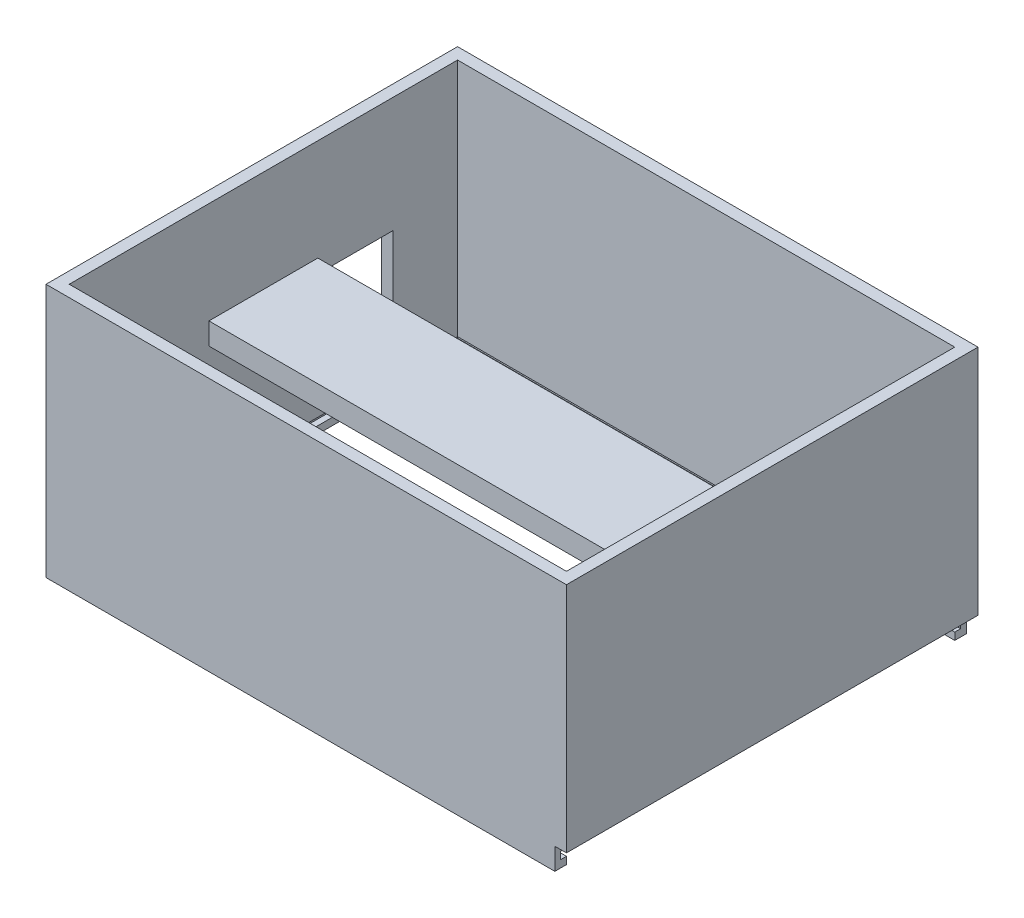
ISO-10303-21;
HEADER;
FILE_DESCRIPTION(('STEP AP214'),'2;1');
FILE_NAME('part.step','',(''),(''),'','','');
FILE_SCHEMA(('AUTOMOTIVE_DESIGN { 1 0 10303 214 1 1 1 1 }'));
ENDSEC;
DATA;
#1=APPLICATION_CONTEXT('core data for automotive mechanical design processes');
#2=APPLICATION_PROTOCOL_DEFINITION('international standard','automotive_design',2000,#1);
#3=PRODUCT_CONTEXT('',#1,'mechanical');
#4=PRODUCT('Part','Part','',(#3));
#5=PRODUCT_RELATED_PRODUCT_CATEGORY('part','',(#4));
#6=PRODUCT_DEFINITION_FORMATION('','',#4);
#7=PRODUCT_DEFINITION_CONTEXT('part definition',#1,'design');
#8=PRODUCT_DEFINITION('design','',#6,#7);
#9=PRODUCT_DEFINITION_SHAPE('','',#8);
#10=(LENGTH_UNIT() NAMED_UNIT(*) SI_UNIT(.MILLI.,.METRE.));
#11=(NAMED_UNIT(*) PLANE_ANGLE_UNIT() SI_UNIT($,.RADIAN.));
#12=(NAMED_UNIT(*) SI_UNIT($,.STERADIAN.) SOLID_ANGLE_UNIT());
#13=UNCERTAINTY_MEASURE_WITH_UNIT(LENGTH_MEASURE(1.E-05),#10,'distance_accuracy_value','');
#14=(GEOMETRIC_REPRESENTATION_CONTEXT(3) GLOBAL_UNCERTAINTY_ASSIGNED_CONTEXT((#13)) GLOBAL_UNIT_ASSIGNED_CONTEXT((#10,
#11,#12)) REPRESENTATION_CONTEXT('',''));
#15=CARTESIAN_POINT('',(0.,0.,0.));
#16=DIRECTION('',(0.,0.,1.));
#17=DIRECTION('',(1.,0.,0.));
#18=AXIS2_PLACEMENT_3D('',#15,#16,#17);
#19=CARTESIAN_POINT('',(-33.0209693760518,32.,34.9955036156109));
#20=DIRECTION('',(1.,0.,0.));
#21=DIRECTION('',(0.,0.,-1.));
#22=AXIS2_PLACEMENT_3D('',#19,#20,#21);
#23=PLANE('',#22);
#24=DIRECTION('',(0.,0.,1.));
#25=VECTOR('',#24,1.);
#26=CARTESIAN_POINT('',(-33.0209693760518,-1.,34.9955036156109));
#27=LINE('',#26,#25);
#28=CARTESIAN_POINT('',(-33.0209693760518,-1.,-18.5044963843891));
#29=VERTEX_POINT('',#28);
#30=CARTESIAN_POINT('',(-33.0209693760518,-1.,34.9955036156109));
#31=VERTEX_POINT('',#30);
#32=EDGE_CURVE('E296',#29,#31,#27,.T.);
#33=ORIENTED_EDGE('',*,*,#32,.F.);
#34=DIRECTION('',(0.,-1.,0.));
#35=VECTOR('',#34,1.);
#36=CARTESIAN_POINT('',(-33.0209693760518,32.,-18.5044963843891));
#37=LINE('',#36,#35);
#38=CARTESIAN_POINT('',(-33.0209693760518,32.,-18.5044963843891));
#39=VERTEX_POINT('',#38);
#40=EDGE_CURVE('E461',#39,#29,#37,.T.);
#41=ORIENTED_EDGE('',*,*,#40,.F.);
#42=DIRECTION('',(0.,0.,1.));
#43=VECTOR('',#42,1.);
#44=CARTESIAN_POINT('',(-33.0209693760518,32.,34.9955036156109));
#45=LINE('',#44,#43);
#46=CARTESIAN_POINT('',(-33.0209693760518,32.,34.9955036156109));
#47=VERTEX_POINT('',#46);
#48=EDGE_CURVE('E450',#39,#47,#45,.T.);
#49=ORIENTED_EDGE('',*,*,#48,.T.);
#50=DIRECTION('',(0.,-1.,0.));
#51=VECTOR('',#50,1.);
#52=CARTESIAN_POINT('',(-33.0209693760518,32.,34.9955036156109));
#53=LINE('',#52,#51);
#54=EDGE_CURVE('E471',#47,#31,#53,.T.);
#55=ORIENTED_EDGE('',*,*,#54,.T.);
#56=EDGE_LOOP('',(#33,#41,#49,#55));
#57=FACE_BOUND('',#56,.T.);
#58=DIRECTION('',(0.,-1.,0.));
#59=VECTOR('',#58,1.);
#60=CARTESIAN_POINT('',(-33.0209693760518,4.1,2.69550361561089));
#61=LINE('',#60,#59);
#62=CARTESIAN_POINT('',(-33.0209693760518,15.,2.69550361561089));
#63=VERTEX_POINT('',#62);
#64=CARTESIAN_POINT('',(-33.0209693760518,4.1,2.69550361561089));
#65=VERTEX_POINT('',#64);
#66=EDGE_CURVE('E390',#63,#65,#61,.T.);
#67=ORIENTED_EDGE('',*,*,#66,.F.);
#68=DIRECTION('',(0.,0.,-1.));
#69=VECTOR('',#68,1.);
#70=CARTESIAN_POINT('',(-33.0209693760518,15.,15.7455036156109));
#71=LINE('',#70,#69);
#72=CARTESIAN_POINT('',(-33.0209693760518,15.,15.7455036156109));
#73=VERTEX_POINT('',#72);
#74=EDGE_CURVE('E431',#73,#63,#71,.T.);
#75=ORIENTED_EDGE('',*,*,#74,.F.);
#76=DIRECTION('',(0.,-1.,0.));
#77=VECTOR('',#76,1.);
#78=CARTESIAN_POINT('',(-33.0209693760518,15.,15.7455036156109));
#79=LINE('',#78,#77);
#80=CARTESIAN_POINT('',(-33.0209693760518,18.,15.7455036156109));
#81=VERTEX_POINT('',#80);
#82=EDGE_CURVE('E422',#81,#73,#79,.T.);
#83=ORIENTED_EDGE('',*,*,#82,.F.);
#84=DIRECTION('',(0.,0.,1.));
#85=VECTOR('',#84,1.);
#86=CARTESIAN_POINT('',(-33.0209693760518,18.,15.7455036156109));
#87=LINE('',#86,#85);
#88=CARTESIAN_POINT('',(-33.0209693760518,18.,0.745503615610897));
#89=VERTEX_POINT('',#88);
#90=EDGE_CURVE('E436',#89,#81,#87,.T.);
#91=ORIENTED_EDGE('',*,*,#90,.F.);
#92=DIRECTION('',(0.,1.,0.));
#93=VECTOR('',#92,1.);
#94=CARTESIAN_POINT('',(-33.0209693760518,15.,0.745503615610894));
#95=LINE('',#94,#93);
#96=CARTESIAN_POINT('',(-33.0209693760518,16.1,0.745503615610894));
#97=VERTEX_POINT('',#96);
#98=EDGE_CURVE('E434',#97,#89,#95,.T.);
#99=ORIENTED_EDGE('',*,*,#98,.F.);
#100=DIRECTION('',(0.,0.,1.));
#101=VECTOR('',#100,1.);
#102=CARTESIAN_POINT('',(-33.0209693760518,16.1,2.69550361561089));
#103=LINE('',#102,#101);
#104=CARTESIAN_POINT('',(-33.0209693760518,16.1,-9.60449638438911));
#105=VERTEX_POINT('',#104);
#106=EDGE_CURVE('E401',#105,#97,#103,.T.);
#107=ORIENTED_EDGE('',*,*,#106,.F.);
#108=DIRECTION('',(0.,1.,0.));
#109=VECTOR('',#108,1.);
#110=CARTESIAN_POINT('',(-33.0209693760518,4.1,-9.60449638438911));
#111=LINE('',#110,#109);
#112=CARTESIAN_POINT('',(-33.0209693760518,4.1,-9.60449638438911));
#113=VERTEX_POINT('',#112);
#114=EDGE_CURVE('E415',#113,#105,#111,.T.);
#115=ORIENTED_EDGE('',*,*,#114,.F.);
#116=DIRECTION('',(0.,0.,-1.));
#117=VECTOR('',#116,1.);
#118=CARTESIAN_POINT('',(-33.0209693760518,4.1,2.69550361561089));
#119=LINE('',#118,#117);
#120=EDGE_CURVE('E412',#65,#113,#119,.T.);
#121=ORIENTED_EDGE('',*,*,#120,.F.);
#122=EDGE_LOOP('',(#67,#75,#83,#91,#99,#107,#115,#121));
#123=FACE_BOUND('',#122,.T.);
#124=DIRECTION('',(0.,-1.,0.));
#125=VECTOR('',#124,1.);
#126=CARTESIAN_POINT('',(-33.0209693760518,4.1,31.8955036156109));
#127=LINE('',#126,#125);
#128=CARTESIAN_POINT('',(-33.0209693760518,15.1,31.8955036156109));
#129=VERTEX_POINT('',#128);
#130=CARTESIAN_POINT('',(-33.0209693760518,4.1,31.8955036156109));
#131=VERTEX_POINT('',#130);
#132=EDGE_CURVE('E364',#129,#131,#127,.T.);
#133=ORIENTED_EDGE('',*,*,#132,.F.);
#134=DIRECTION('',(0.,0.,1.));
#135=VECTOR('',#134,1.);
#136=CARTESIAN_POINT('',(-33.0209693760518,15.1,31.8955036156109));
#137=LINE('',#136,#135);
#138=CARTESIAN_POINT('',(-33.0209693760518,15.1,22.5955036156109));
#139=VERTEX_POINT('',#138);
#140=EDGE_CURVE('E369',#139,#129,#137,.T.);
#141=ORIENTED_EDGE('',*,*,#140,.F.);
#142=DIRECTION('',(0.,1.,0.));
#143=VECTOR('',#142,1.);
#144=CARTESIAN_POINT('',(-33.0209693760518,4.1,22.5955036156109));
#145=LINE('',#144,#143);
#146=CARTESIAN_POINT('',(-33.0209693760518,4.1,22.5955036156109));
#147=VERTEX_POINT('',#146);
#148=EDGE_CURVE('E383',#147,#139,#145,.T.);
#149=ORIENTED_EDGE('',*,*,#148,.F.);
#150=DIRECTION('',(0.,0.,-1.));
#151=VECTOR('',#150,1.);
#152=CARTESIAN_POINT('',(-33.0209693760518,4.1,31.8955036156109));
#153=LINE('',#152,#151);
#154=EDGE_CURVE('E380',#131,#147,#153,.T.);
#155=ORIENTED_EDGE('',*,*,#154,.F.);
#156=EDGE_LOOP('',(#133,#141,#149,#155));
#157=FACE_BOUND('',#156,.T.);
#158=ADVANCED_FACE('F33',(#57,#123,#157),#23,.T.);
#159=CARTESIAN_POINT('',(-33.0209693760518,32.,34.9955036156109));
#160=DIRECTION('',(0.,0.,-1.));
#161=DIRECTION('',(-1.,0.,0.));
#162=AXIS2_PLACEMENT_3D('',#159,#160,#161);
#163=PLANE('',#162);
#164=DIRECTION('',(1.,0.,0.));
#165=VECTOR('',#164,1.);
#166=CARTESIAN_POINT('',(-33.0209693760518,-1.,34.9955036156109));
#167=LINE('',#166,#165);
#168=CARTESIAN_POINT('',(35.4790306239482,-1.,34.9955036156109));
#169=VERTEX_POINT('',#168);
#170=EDGE_CURVE('E298',#31,#169,#167,.T.);
#171=ORIENTED_EDGE('',*,*,#170,.F.);
#172=ORIENTED_EDGE('',*,*,#54,.F.);
#173=DIRECTION('',(1.,0.,0.));
#174=VECTOR('',#173,1.);
#175=CARTESIAN_POINT('',(-33.0209693760518,32.,34.9955036156109));
#176=LINE('',#175,#174);
#177=CARTESIAN_POINT('',(35.4790306239482,32.,34.9955036156109));
#178=VERTEX_POINT('',#177);
#179=EDGE_CURVE('E452',#47,#178,#176,.T.);
#180=ORIENTED_EDGE('',*,*,#179,.T.);
#181=DIRECTION('',(0.,-1.,0.));
#182=VECTOR('',#181,1.);
#183=CARTESIAN_POINT('',(35.4790306239482,32.,34.9955036156109));
#184=LINE('',#183,#182);
#185=CARTESIAN_POINT('',(35.4790306239482,0.,34.9955036156109));
#186=VERTEX_POINT('',#185);
#187=EDGE_CURVE('E467',#178,#186,#184,.T.);
#188=ORIENTED_EDGE('',*,*,#187,.T.);
#189=DIRECTION('',(0.,1.,0.));
#190=VECTOR('',#189,1.);
#191=CARTESIAN_POINT('',(35.4790306239482,-3.,34.9955036156109));
#192=LINE('',#191,#190);
#193=EDGE_CURVE('E333',#169,#186,#192,.T.);
#194=ORIENTED_EDGE('',*,*,#193,.F.);
#195=EDGE_LOOP('',(#171,#172,#180,#188,#194));
#196=FACE_BOUND('',#195,.T.);
#197=ADVANCED_FACE('F530',(#196),#163,.T.);
#198=CARTESIAN_POINT('',(-33.0209693760518,32.,-18.5044963843891));
#199=DIRECTION('',(0.,0.,1.));
#200=DIRECTION('',(1.,0.,0.));
#201=AXIS2_PLACEMENT_3D('',#198,#199,#200);
#202=PLANE('',#201);
#203=DIRECTION('',(-1.,0.,0.));
#204=VECTOR('',#203,1.);
#205=CARTESIAN_POINT('',(-33.0209693760518,-1.,-18.5044963843891));
#206=LINE('',#205,#204);
#207=CARTESIAN_POINT('',(35.4790306239482,-1.,-18.5044963843891));
#208=VERTEX_POINT('',#207);
#209=EDGE_CURVE('E294',#208,#29,#206,.T.);
#210=ORIENTED_EDGE('',*,*,#209,.F.);
#211=DIRECTION('',(0.,1.,0.));
#212=VECTOR('',#211,1.);
#213=CARTESIAN_POINT('',(35.4790306239482,-3.,-18.5044963843891));
#214=LINE('',#213,#212);
#215=CARTESIAN_POINT('',(35.4790306239482,0.,-18.5044963843891));
#216=VERTEX_POINT('',#215);
#217=EDGE_CURVE('E341',#208,#216,#214,.T.);
#218=ORIENTED_EDGE('',*,*,#217,.T.);
#219=DIRECTION('',(0.,-1.,0.));
#220=VECTOR('',#219,1.);
#221=CARTESIAN_POINT('',(35.4790306239482,32.,-18.5044963843891));
#222=LINE('',#221,#220);
#223=CARTESIAN_POINT('',(35.4790306239482,32.,-18.5044963843891));
#224=VERTEX_POINT('',#223);
#225=EDGE_CURVE('E464',#224,#216,#222,.T.);
#226=ORIENTED_EDGE('',*,*,#225,.F.);
#227=DIRECTION('',(-1.,0.,0.));
#228=VECTOR('',#227,1.);
#229=CARTESIAN_POINT('',(-33.0209693760518,32.,-18.5044963843891));
#230=LINE('',#229,#228);
#231=EDGE_CURVE('E457',#224,#39,#230,.T.);
#232=ORIENTED_EDGE('',*,*,#231,.T.);
#233=ORIENTED_EDGE('',*,*,#40,.T.);
#234=EDGE_LOOP('',(#210,#218,#226,#232,#233));
#235=FACE_BOUND('',#234,.T.);
#236=ADVANCED_FACE('F521',(#235),#202,.T.);
#237=CARTESIAN_POINT('',(0.,0.,0.));
#238=DIRECTION('',(0.,1.,0.));
#239=DIRECTION('',(0.,0.,1.));
#240=AXIS2_PLACEMENT_3D('',#237,#238,#239);
#241=PLANE('',#240);
#242=DIRECTION('',(0.,0.,1.));
#243=VECTOR('',#242,1.);
#244=CARTESIAN_POINT('',(35.4790306239482,0.,36.5955036156109));
#245=LINE('',#244,#243);
#246=CARTESIAN_POINT('',(35.4790306239482,0.,36.5955036156109));
#247=VERTEX_POINT('',#246);
#248=EDGE_CURVE('E305',#186,#247,#245,.T.);
#249=ORIENTED_EDGE('',*,*,#248,.F.);
#250=DIRECTION('',(0.,0.,-1.));
#251=VECTOR('',#250,1.);
#252=CARTESIAN_POINT('',(35.4790306239482,0.,34.9955036156109));
#253=LINE('',#252,#251);
#254=EDGE_CURVE('E449',#186,#216,#253,.T.);
#255=ORIENTED_EDGE('',*,*,#254,.T.);
#256=DIRECTION('',(0.,0.,1.));
#257=VECTOR('',#256,1.);
#258=CARTESIAN_POINT('',(35.4790306239482,0.,-18.5044963843891));
#259=LINE('',#258,#257);
#260=CARTESIAN_POINT('',(35.4790306239482,0.,-20.1044963843891));
#261=VERTEX_POINT('',#260);
#262=EDGE_CURVE('E300',#261,#216,#259,.T.);
#263=ORIENTED_EDGE('',*,*,#262,.F.);
#264=DIRECTION('',(-1.,0.,0.));
#265=VECTOR('',#264,1.);
#266=CARTESIAN_POINT('',(-34.6209693760518,0.,-20.1044963843891));
#267=LINE('',#266,#265);
#268=CARTESIAN_POINT('',(37.0790306239482,0.,-20.1044963843891));
#269=VERTEX_POINT('',#268);
#270=EDGE_CURVE('E478',#269,#261,#267,.T.);
#271=ORIENTED_EDGE('',*,*,#270,.F.);
#272=DIRECTION('',(0.,0.,-1.));
#273=VECTOR('',#272,1.);
#274=CARTESIAN_POINT('',(37.0790306239482,0.,-20.1044963843891));
#275=LINE('',#274,#273);
#276=CARTESIAN_POINT('',(37.0790306239482,0.,36.5955036156109));
#277=VERTEX_POINT('',#276);
#278=EDGE_CURVE('E487',#277,#269,#275,.T.);
#279=ORIENTED_EDGE('',*,*,#278,.F.);
#280=DIRECTION('',(1.,0.,0.));
#281=VECTOR('',#280,1.);
#282=CARTESIAN_POINT('',(-34.6209693760518,0.,36.5955036156109));
#283=LINE('',#282,#281);
#284=EDGE_CURVE('E56',#247,#277,#283,.T.);
#285=ORIENTED_EDGE('',*,*,#284,.F.);
#286=EDGE_LOOP('',(#249,#255,#263,#271,#279,#285));
#287=FACE_BOUND('',#286,.T.);
#288=ADVANCED_FACE('F518',(#287),#241,.F.);
#289=CARTESIAN_POINT('',(36.9790306239482,15.,15.7455036156109));
#290=DIRECTION('',(0.,1.,0.));
#291=DIRECTION('',(0.,0.,1.));
#292=AXIS2_PLACEMENT_3D('',#289,#290,#291);
#293=PLANE('',#292);
#294=DIRECTION('',(-1.,0.,0.));
#295=VECTOR('',#294,1.);
#296=CARTESIAN_POINT('',(36.9790306239482,15.,2.69550361561089));
#297=LINE('',#296,#295);
#298=CARTESIAN_POINT('',(-15.0209693760518,15.,2.69550361561089));
#299=VERTEX_POINT('',#298);
#300=EDGE_CURVE('E360',#299,#63,#297,.T.);
#301=ORIENTED_EDGE('',*,*,#300,.F.);
#302=DIRECTION('',(0.,0.,1.));
#303=VECTOR('',#302,1.);
#304=CARTESIAN_POINT('',(-15.0209693760518,15.,15.7455036156109));
#305=LINE('',#304,#303);
#306=CARTESIAN_POINT('',(-15.0209693760518,15.,0.745503615610894));
#307=VERTEX_POINT('',#306);
#308=EDGE_CURVE('E362',#307,#299,#305,.T.);
#309=ORIENTED_EDGE('',*,*,#308,.F.);
#310=DIRECTION('',(-1.,0.,0.));
#311=VECTOR('',#310,1.);
#312=CARTESIAN_POINT('',(36.9790306239482,15.,0.745503615610894));
#313=LINE('',#312,#311);
#314=CARTESIAN_POINT('',(35.4790306239482,15.,0.745503615610894));
#315=VERTEX_POINT('',#314);
#316=EDGE_CURVE('E444',#315,#307,#313,.T.);
#317=ORIENTED_EDGE('',*,*,#316,.F.);
#318=DIRECTION('',(0.,0.,-1.));
#319=VECTOR('',#318,1.);
#320=CARTESIAN_POINT('',(35.4790306239482,15.,34.9955036156109));
#321=LINE('',#320,#319);
#322=CARTESIAN_POINT('',(35.4790306239482,15.,15.7455036156109));
#323=VERTEX_POINT('',#322);
#324=EDGE_CURVE('E612',#323,#315,#321,.T.);
#325=ORIENTED_EDGE('',*,*,#324,.F.);
#326=DIRECTION('',(-1.,0.,0.));
#327=VECTOR('',#326,1.);
#328=CARTESIAN_POINT('',(36.9790306239482,15.,15.7455036156109));
#329=LINE('',#328,#327);
#330=EDGE_CURVE('E447',#323,#73,#329,.T.);
#331=ORIENTED_EDGE('',*,*,#330,.T.);
#332=ORIENTED_EDGE('',*,*,#74,.T.);
#333=EDGE_LOOP('',(#301,#309,#317,#325,#331,#332));
#334=FACE_BOUND('',#333,.T.);
#335=ADVANCED_FACE('F520',(#334),#293,.F.);
#336=CARTESIAN_POINT('',(36.9790306239482,15.,0.745503615610894));
#337=DIRECTION('',(0.,0.,1.));
#338=DIRECTION('',(1.,0.,0.));
#339=AXIS2_PLACEMENT_3D('',#336,#337,#338);
#340=PLANE('',#339);
#341=DIRECTION('',(1.,0.,0.));
#342=VECTOR('',#341,1.);
#343=CARTESIAN_POINT('',(36.9790306239482,16.1,0.745503615610894));
#344=LINE('',#343,#342);
#345=CARTESIAN_POINT('',(-15.0209693760518,16.1,0.745503615610894));
#346=VERTEX_POINT('',#345);
#347=EDGE_CURVE('E358',#97,#346,#344,.T.);
#348=ORIENTED_EDGE('',*,*,#347,.F.);
#349=ORIENTED_EDGE('',*,*,#98,.T.);
#350=DIRECTION('',(-1.,0.,0.));
#351=VECTOR('',#350,1.);
#352=CARTESIAN_POINT('',(36.9790306239482,18.,0.745503615610894));
#353=LINE('',#352,#351);
#354=CARTESIAN_POINT('',(35.4790306239482,18.,0.745503615610894));
#355=VERTEX_POINT('',#354);
#356=EDGE_CURVE('E441',#355,#89,#353,.T.);
#357=ORIENTED_EDGE('',*,*,#356,.F.);
#358=DIRECTION('',(0.,1.,0.));
#359=VECTOR('',#358,1.);
#360=CARTESIAN_POINT('',(35.4790306239482,32.,0.74550361561089));
#361=LINE('',#360,#359);
#362=EDGE_CURVE('E605',#315,#355,#361,.T.);
#363=ORIENTED_EDGE('',*,*,#362,.F.);
#364=ORIENTED_EDGE('',*,*,#316,.T.);
#365=DIRECTION('',(0.,-1.,0.));
#366=VECTOR('',#365,1.);
#367=CARTESIAN_POINT('',(-15.0209693760518,15.,0.745503615610894));
#368=LINE('',#367,#366);
#369=EDGE_CURVE('E41',#346,#307,#368,.T.);
#370=ORIENTED_EDGE('',*,*,#369,.F.);
#371=EDGE_LOOP('',(#348,#349,#357,#363,#364,#370));
#372=FACE_BOUND('',#371,.T.);
#373=ADVANCED_FACE('F527',(#372),#340,.F.);
#374=DIRECTION('',(0.,0.,-1.));
#375=VECTOR('',#374,1.);
#376=CARTESIAN_POINT('',(-33.0209693760518,-2.,34.9955036156109));
#377=LINE('',#376,#375);
#378=CARTESIAN_POINT('',(-33.0209693760518,-2.,34.9955036156109));
#379=VERTEX_POINT('',#378);
#380=CARTESIAN_POINT('',(-33.0209693760518,-2.,-18.5044963843891));
#381=VERTEX_POINT('',#380);
#382=EDGE_CURVE('E290',#379,#381,#377,.T.);
#383=ORIENTED_EDGE('',*,*,#382,.F.);
#384=CARTESIAN_POINT('',(-33.0209693760518,-3.,34.9955036156109));
#385=VERTEX_POINT('',#384);
#386=EDGE_CURVE('E470',#379,#385,#53,.T.);
#387=ORIENTED_EDGE('',*,*,#386,.T.);
#388=DIRECTION('',(0.,0.,1.));
#389=VECTOR('',#388,1.);
#390=CARTESIAN_POINT('',(-33.0209693760518,-3.,34.9955036156109));
#391=LINE('',#390,#389);
#392=CARTESIAN_POINT('',(-33.0209693760518,-3.,-18.5044963843891));
#393=VERTEX_POINT('',#392);
#394=EDGE_CURVE('E315',#393,#385,#391,.T.);
#395=ORIENTED_EDGE('',*,*,#394,.F.);
#396=EDGE_CURVE('E459',#381,#393,#37,.T.);
#397=ORIENTED_EDGE('',*,*,#396,.F.);
#398=EDGE_LOOP('',(#383,#387,#395,#397));
#399=FACE_BOUND('',#398,.T.);
#400=ADVANCED_FACE('F538',(#399),#23,.T.);
#401=CARTESIAN_POINT('',(35.4790306239482,32.,34.9955036156109));
#402=DIRECTION('',(-1.,0.,0.));
#403=DIRECTION('',(0.,0.,1.));
#404=AXIS2_PLACEMENT_3D('',#401,#402,#403);
#405=PLANE('',#404);
#406=ORIENTED_EDGE('',*,*,#254,.F.);
#407=ORIENTED_EDGE('',*,*,#187,.F.);
#408=DIRECTION('',(0.,0.,-1.));
#409=VECTOR('',#408,1.);
#410=CARTESIAN_POINT('',(35.4790306239482,32.,34.9955036156109));
#411=LINE('',#410,#409);
#412=EDGE_CURVE('E454',#178,#224,#411,.T.);
#413=ORIENTED_EDGE('',*,*,#412,.T.);
#414=ORIENTED_EDGE('',*,*,#225,.T.);
#415=EDGE_LOOP('',(#406,#407,#413,#414));
#416=FACE_BOUND('',#415,.T.);
#417=DIRECTION('',(0.,0.,1.));
#418=VECTOR('',#417,1.);
#419=CARTESIAN_POINT('',(35.4790306239482,18.,34.9955036156109));
#420=LINE('',#419,#418);
#421=CARTESIAN_POINT('',(35.4790306239482,18.,15.7455036156109));
#422=VERTEX_POINT('',#421);
#423=EDGE_CURVE('E602',#355,#422,#420,.T.);
#424=ORIENTED_EDGE('',*,*,#423,.T.);
#425=DIRECTION('',(0.,-1.,0.));
#426=VECTOR('',#425,1.);
#427=CARTESIAN_POINT('',(35.4790306239482,32.,15.7455036156109));
#428=LINE('',#427,#426);
#429=EDGE_CURVE('E615',#422,#323,#428,.T.);
#430=ORIENTED_EDGE('',*,*,#429,.T.);
#431=ORIENTED_EDGE('',*,*,#324,.T.);
#432=ORIENTED_EDGE('',*,*,#362,.T.);
#433=EDGE_LOOP('',(#424,#430,#431,#432));
#434=FACE_BOUND('',#433,.T.);
#435=ADVANCED_FACE('F548',(#416,#434),#405,.T.);
#436=CARTESIAN_POINT('',(0.,32.,0.));
#437=DIRECTION('',(0.,1.,0.));
#438=DIRECTION('',(0.,0.,1.));
#439=AXIS2_PLACEMENT_3D('',#436,#437,#438);
#440=PLANE('',#439);
#441=DIRECTION('',(0.,0.,1.));
#442=VECTOR('',#441,1.);
#443=CARTESIAN_POINT('',(-34.6209693760518,32.,-20.1044963843891));
#444=LINE('',#443,#442);
#445=CARTESIAN_POINT('',(-34.6209693760518,32.,-20.1044963843891));
#446=VERTEX_POINT('',#445);
#447=CARTESIAN_POINT('',(-34.6209693760518,32.,36.5955036156109));
#448=VERTEX_POINT('',#447);
#449=EDGE_CURVE('E474',#446,#448,#444,.T.);
#450=ORIENTED_EDGE('',*,*,#449,.T.);
#451=DIRECTION('',(1.,0.,0.));
#452=VECTOR('',#451,1.);
#453=CARTESIAN_POINT('',(-34.6209693760518,32.,36.5955036156109));
#454=LINE('',#453,#452);
#455=CARTESIAN_POINT('',(37.0790306239482,32.,36.5955036156109));
#456=VERTEX_POINT('',#455);
#457=EDGE_CURVE('E477',#448,#456,#454,.T.);
#458=ORIENTED_EDGE('',*,*,#457,.T.);
#459=DIRECTION('',(0.,0.,-1.));
#460=VECTOR('',#459,1.);
#461=CARTESIAN_POINT('',(37.0790306239482,32.,-20.1044963843891));
#462=LINE('',#461,#460);
#463=CARTESIAN_POINT('',(37.0790306239482,32.,-20.1044963843891));
#464=VERTEX_POINT('',#463);
#465=EDGE_CURVE('E480',#456,#464,#462,.T.);
#466=ORIENTED_EDGE('',*,*,#465,.T.);
#467=DIRECTION('',(-1.,0.,0.));
#468=VECTOR('',#467,1.);
#469=CARTESIAN_POINT('',(-34.6209693760518,32.,-20.1044963843891));
#470=LINE('',#469,#468);
#471=EDGE_CURVE('E482',#464,#446,#470,.T.);
#472=ORIENTED_EDGE('',*,*,#471,.T.);
#473=EDGE_LOOP('',(#450,#458,#466,#472));
#474=FACE_BOUND('',#473,.T.);
#475=ORIENTED_EDGE('',*,*,#179,.F.);
#476=ORIENTED_EDGE('',*,*,#48,.F.);
#477=ORIENTED_EDGE('',*,*,#231,.F.);
#478=ORIENTED_EDGE('',*,*,#412,.F.);
#479=EDGE_LOOP('',(#475,#476,#477,#478));
#480=FACE_BOUND('',#479,.T.);
#481=ADVANCED_FACE('F554',(#474,#480),#440,.T.);
#482=CARTESIAN_POINT('',(-34.6209693760518,32.,-20.1044963843891));
#483=DIRECTION('',(1.,0.,0.));
#484=DIRECTION('',(0.,0.,-1.));
#485=AXIS2_PLACEMENT_3D('',#482,#483,#484);
#486=PLANE('',#485);
#487=DIRECTION('',(0.,0.,1.));
#488=VECTOR('',#487,1.);
#489=CARTESIAN_POINT('',(-34.6209693760518,15.1,31.8955036156109));
#490=LINE('',#489,#488);
#491=CARTESIAN_POINT('',(-34.6209693760518,15.1,22.5955036156109));
#492=VERTEX_POINT('',#491);
#493=CARTESIAN_POINT('',(-34.6209693760518,15.1,31.8955036156109));
#494=VERTEX_POINT('',#493);
#495=EDGE_CURVE('E375',#492,#494,#490,.T.);
#496=ORIENTED_EDGE('',*,*,#495,.T.);
#497=DIRECTION('',(0.,-1.,0.));
#498=VECTOR('',#497,1.);
#499=CARTESIAN_POINT('',(-34.6209693760518,4.1,31.8955036156109));
#500=LINE('',#499,#498);
#501=CARTESIAN_POINT('',(-34.6209693760518,4.1,31.8955036156109));
#502=VERTEX_POINT('',#501);
#503=EDGE_CURVE('E365',#494,#502,#500,.T.);
#504=ORIENTED_EDGE('',*,*,#503,.T.);
#505=DIRECTION('',(0.,0.,-1.));
#506=VECTOR('',#505,1.);
#507=CARTESIAN_POINT('',(-34.6209693760518,4.1,31.8955036156109));
#508=LINE('',#507,#506);
#509=CARTESIAN_POINT('',(-34.6209693760518,4.1,22.5955036156109));
#510=VERTEX_POINT('',#509);
#511=EDGE_CURVE('E368',#502,#510,#508,.T.);
#512=ORIENTED_EDGE('',*,*,#511,.T.);
#513=DIRECTION('',(0.,1.,0.));
#514=VECTOR('',#513,1.);
#515=CARTESIAN_POINT('',(-34.6209693760518,4.1,22.5955036156109));
#516=LINE('',#515,#514);
#517=EDGE_CURVE('E372',#510,#492,#516,.T.);
#518=ORIENTED_EDGE('',*,*,#517,.T.);
#519=EDGE_LOOP('',(#496,#504,#512,#518));
#520=FACE_BOUND('',#519,.T.);
#521=DIRECTION('',(0.,0.,1.));
#522=VECTOR('',#521,1.);
#523=CARTESIAN_POINT('',(-34.6209693760518,16.1,2.69550361561089));
#524=LINE('',#523,#522);
#525=CARTESIAN_POINT('',(-34.6209693760518,16.1,-9.60449638438911));
#526=VERTEX_POINT('',#525);
#527=CARTESIAN_POINT('',(-34.6209693760518,16.1,2.69550361561089));
#528=VERTEX_POINT('',#527);
#529=EDGE_CURVE('E407',#526,#528,#524,.T.);
#530=ORIENTED_EDGE('',*,*,#529,.T.);
#531=DIRECTION('',(0.,-1.,0.));
#532=VECTOR('',#531,1.);
#533=CARTESIAN_POINT('',(-34.6209693760518,4.1,2.69550361561089));
#534=LINE('',#533,#532);
#535=CARTESIAN_POINT('',(-34.6209693760518,4.1,2.69550361561089));
#536=VERTEX_POINT('',#535);
#537=EDGE_CURVE('E397',#528,#536,#534,.T.);
#538=ORIENTED_EDGE('',*,*,#537,.T.);
#539=DIRECTION('',(0.,0.,-1.));
#540=VECTOR('',#539,1.);
#541=CARTESIAN_POINT('',(-34.6209693760518,4.1,2.69550361561089));
#542=LINE('',#541,#540);
#543=CARTESIAN_POINT('',(-34.6209693760518,4.1,-9.60449638438911));
#544=VERTEX_POINT('',#543);
#545=EDGE_CURVE('E400',#536,#544,#542,.T.);
#546=ORIENTED_EDGE('',*,*,#545,.T.);
#547=DIRECTION('',(0.,1.,0.));
#548=VECTOR('',#547,1.);
#549=CARTESIAN_POINT('',(-34.6209693760518,4.1,-9.60449638438911));
#550=LINE('',#549,#548);
#551=EDGE_CURVE('E404',#544,#526,#550,.T.);
#552=ORIENTED_EDGE('',*,*,#551,.T.);
#553=EDGE_LOOP('',(#530,#538,#546,#552));
#554=FACE_BOUND('',#553,.T.);
#555=DIRECTION('',(0.,-1.,0.));
#556=VECTOR('',#555,1.);
#557=CARTESIAN_POINT('',(-34.6209693760518,32.,-20.1044963843891));
#558=LINE('',#557,#556);
#559=CARTESIAN_POINT('',(-34.6209693760518,-3.,-20.1044963843891));
#560=VERTEX_POINT('',#559);
#561=EDGE_CURVE('E484',#446,#560,#558,.T.);
#562=ORIENTED_EDGE('',*,*,#561,.T.);
#563=DIRECTION('',(0.,0.,-1.));
#564=VECTOR('',#563,1.);
#565=CARTESIAN_POINT('',(-34.6209693760518,-3.,-20.1044963843891));
#566=LINE('',#565,#564);
#567=CARTESIAN_POINT('',(-34.6209693760518,-3.,36.5955036156109));
#568=VERTEX_POINT('',#567);
#569=EDGE_CURVE('E304',#568,#560,#566,.T.);
#570=ORIENTED_EDGE('',*,*,#569,.F.);
#571=DIRECTION('',(0.,-1.,0.));
#572=VECTOR('',#571,1.);
#573=CARTESIAN_POINT('',(-34.6209693760518,32.,36.5955036156109));
#574=LINE('',#573,#572);
#575=EDGE_CURVE('E601',#448,#568,#574,.T.);
#576=ORIENTED_EDGE('',*,*,#575,.F.);
#577=ORIENTED_EDGE('',*,*,#449,.F.);
#578=EDGE_LOOP('',(#562,#570,#576,#577));
#579=FACE_BOUND('',#578,.T.);
#580=ADVANCED_FACE('F35',(#520,#554,#579),#486,.F.);
#581=CARTESIAN_POINT('',(-34.6209693760518,32.,36.5955036156109));
#582=DIRECTION('',(0.,0.,-1.));
#583=DIRECTION('',(-1.,0.,0.));
#584=AXIS2_PLACEMENT_3D('',#581,#582,#583);
#585=PLANE('',#584);
#586=ORIENTED_EDGE('',*,*,#575,.T.);
#587=DIRECTION('',(-1.,0.,0.));
#588=VECTOR('',#587,1.);
#589=CARTESIAN_POINT('',(-34.6209693760518,-3.,36.5955036156109));
#590=LINE('',#589,#588);
#591=CARTESIAN_POINT('',(35.4790306239482,-3.,36.5955036156109));
#592=VERTEX_POINT('',#591);
#593=EDGE_CURVE('E301',#592,#568,#590,.T.);
#594=ORIENTED_EDGE('',*,*,#593,.F.);
#595=DIRECTION('',(0.,1.,0.));
#596=VECTOR('',#595,1.);
#597=CARTESIAN_POINT('',(35.4790306239482,-3.,36.5955036156109));
#598=LINE('',#597,#596);
#599=EDGE_CURVE('E322',#592,#247,#598,.T.);
#600=ORIENTED_EDGE('',*,*,#599,.T.);
#601=ORIENTED_EDGE('',*,*,#284,.T.);
#602=DIRECTION('',(0.,-1.,0.));
#603=VECTOR('',#602,1.);
#604=CARTESIAN_POINT('',(37.0790306239482,32.,36.5955036156109));
#605=LINE('',#604,#603);
#606=EDGE_CURVE('E517',#456,#277,#605,.T.);
#607=ORIENTED_EDGE('',*,*,#606,.F.);
#608=ORIENTED_EDGE('',*,*,#457,.F.);
#609=EDGE_LOOP('',(#586,#594,#600,#601,#607,#608));
#610=FACE_BOUND('',#609,.T.);
#611=ADVANCED_FACE('F595',(#610),#585,.F.);
#612=CARTESIAN_POINT('',(37.0790306239482,32.,-20.1044963843891));
#613=DIRECTION('',(-1.,0.,0.));
#614=DIRECTION('',(0.,0.,1.));
#615=AXIS2_PLACEMENT_3D('',#612,#613,#614);
#616=PLANE('',#615);
#617=ORIENTED_EDGE('',*,*,#278,.T.);
#618=DIRECTION('',(0.,-1.,0.));
#619=VECTOR('',#618,1.);
#620=CARTESIAN_POINT('',(37.0790306239482,32.,-20.1044963843891));
#621=LINE('',#620,#619);
#622=EDGE_CURVE('E511',#464,#269,#621,.T.);
#623=ORIENTED_EDGE('',*,*,#622,.F.);
#624=ORIENTED_EDGE('',*,*,#465,.F.);
#625=ORIENTED_EDGE('',*,*,#606,.T.);
#626=EDGE_LOOP('',(#617,#623,#624,#625));
#627=FACE_BOUND('',#626,.T.);
#628=ADVANCED_FACE('F514',(#627),#616,.F.);
#629=CARTESIAN_POINT('',(-34.6209693760518,32.,-20.1044963843891));
#630=DIRECTION('',(0.,0.,1.));
#631=DIRECTION('',(1.,0.,0.));
#632=AXIS2_PLACEMENT_3D('',#629,#630,#631);
#633=PLANE('',#632);
#634=ORIENTED_EDGE('',*,*,#270,.T.);
#635=DIRECTION('',(0.,1.,0.));
#636=VECTOR('',#635,1.);
#637=CARTESIAN_POINT('',(35.4790306239482,-3.,-20.1044963843891));
#638=LINE('',#637,#636);
#639=CARTESIAN_POINT('',(35.4790306239482,-3.,-20.1044963843891));
#640=VERTEX_POINT('',#639);
#641=EDGE_CURVE('E350',#640,#261,#638,.T.);
#642=ORIENTED_EDGE('',*,*,#641,.F.);
#643=DIRECTION('',(1.,0.,0.));
#644=VECTOR('',#643,1.);
#645=CARTESIAN_POINT('',(35.4790306239482,-3.,-20.1044963843891));
#646=LINE('',#645,#644);
#647=EDGE_CURVE('E308',#560,#640,#646,.T.);
#648=ORIENTED_EDGE('',*,*,#647,.F.);
#649=ORIENTED_EDGE('',*,*,#561,.F.);
#650=ORIENTED_EDGE('',*,*,#471,.F.);
#651=ORIENTED_EDGE('',*,*,#622,.T.);
#652=EDGE_LOOP('',(#634,#642,#648,#649,#650,#651));
#653=FACE_BOUND('',#652,.T.);
#654=ADVANCED_FACE('F505',(#653),#633,.F.);
#655=DIRECTION('',(-1.,0.,0.));
#656=VECTOR('',#655,1.);
#657=CARTESIAN_POINT('',(-33.0209693760518,-2.,34.9955036156109));
#658=LINE('',#657,#656);
#659=CARTESIAN_POINT('',(35.4790306239482,-2.,34.9955036156109));
#660=VERTEX_POINT('',#659);
#661=EDGE_CURVE('E292',#660,#379,#658,.T.);
#662=ORIENTED_EDGE('',*,*,#661,.F.);
#663=CARTESIAN_POINT('',(35.4790306239482,-3.,34.9955036156109));
#664=VERTEX_POINT('',#663);
#665=EDGE_CURVE('E325',#664,#660,#192,.T.);
#666=ORIENTED_EDGE('',*,*,#665,.F.);
#667=DIRECTION('',(1.,0.,0.));
#668=VECTOR('',#667,1.);
#669=CARTESIAN_POINT('',(35.4790306239482,-3.,34.9955036156109));
#670=LINE('',#669,#668);
#671=EDGE_CURVE('E318',#385,#664,#670,.T.);
#672=ORIENTED_EDGE('',*,*,#671,.F.);
#673=ORIENTED_EDGE('',*,*,#386,.F.);
#674=EDGE_LOOP('',(#662,#666,#672,#673));
#675=FACE_BOUND('',#674,.T.);
#676=ADVANCED_FACE('F544',(#675),#163,.T.);
#677=DIRECTION('',(1.,0.,0.));
#678=VECTOR('',#677,1.);
#679=CARTESIAN_POINT('',(-33.0209693760518,-2.,-18.5044963843891));
#680=LINE('',#679,#678);
#681=CARTESIAN_POINT('',(35.4790306239482,-2.,-18.5044963843891));
#682=VERTEX_POINT('',#681);
#683=EDGE_CURVE('E285',#381,#682,#680,.T.);
#684=ORIENTED_EDGE('',*,*,#683,.F.);
#685=ORIENTED_EDGE('',*,*,#396,.T.);
#686=DIRECTION('',(-1.,0.,0.));
#687=VECTOR('',#686,1.);
#688=CARTESIAN_POINT('',(-33.0209693760518,-3.,-18.5044963843891));
#689=LINE('',#688,#687);
#690=CARTESIAN_POINT('',(35.4790306239482,-3.,-18.5044963843891));
#691=VERTEX_POINT('',#690);
#692=EDGE_CURVE('E312',#691,#393,#689,.T.);
#693=ORIENTED_EDGE('',*,*,#692,.F.);
#694=EDGE_CURVE('E344',#691,#682,#214,.T.);
#695=ORIENTED_EDGE('',*,*,#694,.T.);
#696=EDGE_LOOP('',(#684,#685,#693,#695));
#697=FACE_BOUND('',#696,.T.);
#698=ADVANCED_FACE('F532',(#697),#202,.T.);
#699=CARTESIAN_POINT('',(36.9790306239482,15.,15.7455036156109));
#700=DIRECTION('',(0.,0.,-1.));
#701=DIRECTION('',(-1.,0.,0.));
#702=AXIS2_PLACEMENT_3D('',#699,#700,#701);
#703=PLANE('',#702);
#704=ORIENTED_EDGE('',*,*,#429,.F.);
#705=DIRECTION('',(-1.,0.,0.));
#706=VECTOR('',#705,1.);
#707=CARTESIAN_POINT('',(36.9790306239482,18.,15.7455036156109));
#708=LINE('',#707,#706);
#709=EDGE_CURVE('E439',#422,#81,#708,.T.);
#710=ORIENTED_EDGE('',*,*,#709,.T.);
#711=ORIENTED_EDGE('',*,*,#82,.T.);
#712=ORIENTED_EDGE('',*,*,#330,.F.);
#713=EDGE_LOOP('',(#704,#710,#711,#712));
#714=FACE_BOUND('',#713,.T.);
#715=ADVANCED_FACE('F629',(#714),#703,.F.);
#716=CARTESIAN_POINT('',(36.9790306239482,18.,15.7455036156109));
#717=DIRECTION('',(0.,-1.,0.));
#718=DIRECTION('',(0.,0.,-1.));
#719=AXIS2_PLACEMENT_3D('',#716,#717,#718);
#720=PLANE('',#719);
#721=ORIENTED_EDGE('',*,*,#423,.F.);
#722=ORIENTED_EDGE('',*,*,#356,.T.);
#723=ORIENTED_EDGE('',*,*,#90,.T.);
#724=ORIENTED_EDGE('',*,*,#709,.F.);
#725=EDGE_LOOP('',(#721,#722,#723,#724));
#726=FACE_BOUND('',#725,.T.);
#727=ADVANCED_FACE('F651',(#726),#720,.F.);
#728=CARTESIAN_POINT('',(-34.6209693760518,4.1,2.69550361561089));
#729=DIRECTION('',(0.,0.,1.));
#730=DIRECTION('',(1.,0.,0.));
#731=AXIS2_PLACEMENT_3D('',#728,#729,#730);
#732=PLANE('',#731);
#733=DIRECTION('',(1.,0.,0.));
#734=VECTOR('',#733,1.);
#735=CARTESIAN_POINT('',(-34.6209693760518,16.1,2.69550361561089));
#736=LINE('',#735,#734);
#737=CARTESIAN_POINT('',(-15.0209693760518,16.1,2.69550361561089));
#738=VERTEX_POINT('',#737);
#739=EDGE_CURVE('E420',#528,#738,#736,.T.);
#740=ORIENTED_EDGE('',*,*,#739,.T.);
#741=DIRECTION('',(0.,-1.,0.));
#742=VECTOR('',#741,1.);
#743=CARTESIAN_POINT('',(-15.0209693760518,4.1,2.69550361561089));
#744=LINE('',#743,#742);
#745=EDGE_CURVE('E352',#738,#299,#744,.T.);
#746=ORIENTED_EDGE('',*,*,#745,.T.);
#747=ORIENTED_EDGE('',*,*,#300,.T.);
#748=ORIENTED_EDGE('',*,*,#66,.T.);
#749=DIRECTION('',(1.,0.,0.));
#750=VECTOR('',#749,1.);
#751=CARTESIAN_POINT('',(-34.6209693760518,4.1,2.69550361561089));
#752=LINE('',#751,#750);
#753=EDGE_CURVE('E410',#536,#65,#752,.T.);
#754=ORIENTED_EDGE('',*,*,#753,.F.);
#755=ORIENTED_EDGE('',*,*,#537,.F.);
#756=EDGE_LOOP('',(#740,#746,#747,#748,#754,#755));
#757=FACE_BOUND('',#756,.T.);
#758=ADVANCED_FACE('F638',(#757),#732,.F.);
#759=CARTESIAN_POINT('',(-34.6209693760518,16.1,2.69550361561089));
#760=DIRECTION('',(0.,1.,0.));
#761=DIRECTION('',(0.,0.,1.));
#762=AXIS2_PLACEMENT_3D('',#759,#760,#761);
#763=PLANE('',#762);
#764=ORIENTED_EDGE('',*,*,#106,.T.);
#765=ORIENTED_EDGE('',*,*,#347,.T.);
#766=DIRECTION('',(0.,0.,1.));
#767=VECTOR('',#766,1.);
#768=CARTESIAN_POINT('',(-15.0209693760518,16.1,2.69550361561089));
#769=LINE('',#768,#767);
#770=EDGE_CURVE('E355',#346,#738,#769,.T.);
#771=ORIENTED_EDGE('',*,*,#770,.T.);
#772=ORIENTED_EDGE('',*,*,#739,.F.);
#773=ORIENTED_EDGE('',*,*,#529,.F.);
#774=DIRECTION('',(1.,0.,0.));
#775=VECTOR('',#774,1.);
#776=CARTESIAN_POINT('',(-34.6209693760518,16.1,-9.60449638438911));
#777=LINE('',#776,#775);
#778=EDGE_CURVE('E423',#526,#105,#777,.T.);
#779=ORIENTED_EDGE('',*,*,#778,.T.);
#780=EDGE_LOOP('',(#764,#765,#771,#772,#773,#779));
#781=FACE_BOUND('',#780,.T.);
#782=ADVANCED_FACE('F647',(#781),#763,.F.);
#783=CARTESIAN_POINT('',(-34.6209693760518,4.1,-9.60449638438911));
#784=DIRECTION('',(0.,0.,-1.));
#785=DIRECTION('',(-1.,0.,0.));
#786=AXIS2_PLACEMENT_3D('',#783,#784,#785);
#787=PLANE('',#786);
#788=ORIENTED_EDGE('',*,*,#114,.T.);
#789=ORIENTED_EDGE('',*,*,#778,.F.);
#790=ORIENTED_EDGE('',*,*,#551,.F.);
#791=DIRECTION('',(1.,0.,0.));
#792=VECTOR('',#791,1.);
#793=CARTESIAN_POINT('',(-34.6209693760518,4.1,-9.60449638438911));
#794=LINE('',#793,#792);
#795=EDGE_CURVE('E425',#544,#113,#794,.T.);
#796=ORIENTED_EDGE('',*,*,#795,.T.);
#797=EDGE_LOOP('',(#788,#789,#790,#796));
#798=FACE_BOUND('',#797,.T.);
#799=ADVANCED_FACE('F700',(#798),#787,.F.);
#800=CARTESIAN_POINT('',(-34.6209693760518,4.1,2.69550361561089));
#801=DIRECTION('',(0.,-1.,0.));
#802=DIRECTION('',(0.,0.,-1.));
#803=AXIS2_PLACEMENT_3D('',#800,#801,#802);
#804=PLANE('',#803);
#805=ORIENTED_EDGE('',*,*,#120,.T.);
#806=ORIENTED_EDGE('',*,*,#795,.F.);
#807=ORIENTED_EDGE('',*,*,#545,.F.);
#808=ORIENTED_EDGE('',*,*,#753,.T.);
#809=EDGE_LOOP('',(#805,#806,#807,#808));
#810=FACE_BOUND('',#809,.T.);
#811=ADVANCED_FACE('F642',(#810),#804,.F.);
#812=CARTESIAN_POINT('',(-34.6209693760518,4.1,31.8955036156109));
#813=DIRECTION('',(0.,0.,1.));
#814=DIRECTION('',(1.,0.,0.));
#815=AXIS2_PLACEMENT_3D('',#812,#813,#814);
#816=PLANE('',#815);
#817=ORIENTED_EDGE('',*,*,#132,.T.);
#818=DIRECTION('',(1.,0.,0.));
#819=VECTOR('',#818,1.);
#820=CARTESIAN_POINT('',(-34.6209693760518,4.1,31.8955036156109));
#821=LINE('',#820,#819);
#822=EDGE_CURVE('E378',#502,#131,#821,.T.);
#823=ORIENTED_EDGE('',*,*,#822,.F.);
#824=ORIENTED_EDGE('',*,*,#503,.F.);
#825=DIRECTION('',(1.,0.,0.));
#826=VECTOR('',#825,1.);
#827=CARTESIAN_POINT('',(-34.6209693760518,15.1,31.8955036156109));
#828=LINE('',#827,#826);
#829=EDGE_CURVE('E388',#494,#129,#828,.T.);
#830=ORIENTED_EDGE('',*,*,#829,.T.);
#831=EDGE_LOOP('',(#817,#823,#824,#830));
#832=FACE_BOUND('',#831,.T.);
#833=ADVANCED_FACE('F716',(#832),#816,.F.);
#834=CARTESIAN_POINT('',(-34.6209693760518,15.1,31.8955036156109));
#835=DIRECTION('',(0.,1.,0.));
#836=DIRECTION('',(0.,0.,1.));
#837=AXIS2_PLACEMENT_3D('',#834,#835,#836);
#838=PLANE('',#837);
#839=ORIENTED_EDGE('',*,*,#140,.T.);
#840=ORIENTED_EDGE('',*,*,#829,.F.);
#841=ORIENTED_EDGE('',*,*,#495,.F.);
#842=DIRECTION('',(1.,0.,0.));
#843=VECTOR('',#842,1.);
#844=CARTESIAN_POINT('',(-34.6209693760518,15.1,22.5955036156109));
#845=LINE('',#844,#843);
#846=EDGE_CURVE('E391',#492,#139,#845,.T.);
#847=ORIENTED_EDGE('',*,*,#846,.T.);
#848=EDGE_LOOP('',(#839,#840,#841,#847));
#849=FACE_BOUND('',#848,.T.);
#850=ADVANCED_FACE('F724',(#849),#838,.F.);
#851=CARTESIAN_POINT('',(-34.6209693760518,4.1,22.5955036156109));
#852=DIRECTION('',(0.,0.,-1.));
#853=DIRECTION('',(-1.,0.,0.));
#854=AXIS2_PLACEMENT_3D('',#851,#852,#853);
#855=PLANE('',#854);
#856=ORIENTED_EDGE('',*,*,#148,.T.);
#857=ORIENTED_EDGE('',*,*,#846,.F.);
#858=ORIENTED_EDGE('',*,*,#517,.F.);
#859=DIRECTION('',(1.,0.,0.));
#860=VECTOR('',#859,1.);
#861=CARTESIAN_POINT('',(-34.6209693760518,4.1,22.5955036156109));
#862=LINE('',#861,#860);
#863=EDGE_CURVE('E393',#510,#147,#862,.T.);
#864=ORIENTED_EDGE('',*,*,#863,.T.);
#865=EDGE_LOOP('',(#856,#857,#858,#864));
#866=FACE_BOUND('',#865,.T.);
#867=ADVANCED_FACE('F734',(#866),#855,.F.);
#868=CARTESIAN_POINT('',(-34.6209693760518,4.1,31.8955036156109));
#869=DIRECTION('',(0.,-1.,0.));
#870=DIRECTION('',(0.,0.,-1.));
#871=AXIS2_PLACEMENT_3D('',#868,#869,#870);
#872=PLANE('',#871);
#873=ORIENTED_EDGE('',*,*,#154,.T.);
#874=ORIENTED_EDGE('',*,*,#863,.F.);
#875=ORIENTED_EDGE('',*,*,#511,.F.);
#876=ORIENTED_EDGE('',*,*,#822,.T.);
#877=EDGE_LOOP('',(#873,#874,#875,#876));
#878=FACE_BOUND('',#877,.T.);
#879=ADVANCED_FACE('F744',(#878),#872,.F.);
#880=CARTESIAN_POINT('',(-15.0209693760518,0.,0.));
#881=DIRECTION('',(-1.,0.,0.));
#882=DIRECTION('',(0.,0.,1.));
#883=AXIS2_PLACEMENT_3D('',#880,#881,#882);
#884=PLANE('',#883);
#885=ORIENTED_EDGE('',*,*,#308,.T.);
#886=ORIENTED_EDGE('',*,*,#745,.F.);
#887=ORIENTED_EDGE('',*,*,#770,.F.);
#888=ORIENTED_EDGE('',*,*,#369,.T.);
#889=EDGE_LOOP('',(#885,#886,#887,#888));
#890=FACE_BOUND('',#889,.T.);
#891=ADVANCED_FACE('F621',(#890),#884,.T.);
#892=CARTESIAN_POINT('',(35.4790306239482,-3.,-18.5044963843891));
#893=DIRECTION('',(-1.,0.,0.));
#894=DIRECTION('',(0.,0.,1.));
#895=AXIS2_PLACEMENT_3D('',#892,#893,#894);
#896=PLANE('',#895);
#897=ORIENTED_EDGE('',*,*,#217,.F.);
#898=DIRECTION('',(0.,0.,1.));
#899=VECTOR('',#898,1.);
#900=CARTESIAN_POINT('',(35.4790306239482,-1.,35.7955036156109));
#901=LINE('',#900,#899);
#902=CARTESIAN_POINT('',(35.4790306239482,-1.,-19.3044963843891));
#903=VERTEX_POINT('',#902);
#904=EDGE_CURVE('E270',#903,#208,#901,.T.);
#905=ORIENTED_EDGE('',*,*,#904,.F.);
#906=DIRECTION('',(0.,1.,0.));
#907=VECTOR('',#906,1.);
#908=CARTESIAN_POINT('',(35.4790306239482,-1.,-19.3044963843891));
#909=LINE('',#908,#907);
#910=CARTESIAN_POINT('',(35.4790306239482,-2.,-19.3044963843891));
#911=VERTEX_POINT('',#910);
#912=EDGE_CURVE('E272',#911,#903,#909,.T.);
#913=ORIENTED_EDGE('',*,*,#912,.F.);
#914=DIRECTION('',(0.,0.,-1.));
#915=VECTOR('',#914,1.);
#916=CARTESIAN_POINT('',(35.4790306239482,-2.,35.7955036156109));
#917=LINE('',#916,#915);
#918=EDGE_CURVE('E278',#682,#911,#917,.T.);
#919=ORIENTED_EDGE('',*,*,#918,.F.);
#920=ORIENTED_EDGE('',*,*,#694,.F.);
#921=DIRECTION('',(0.,0.,1.));
#922=VECTOR('',#921,1.);
#923=CARTESIAN_POINT('',(35.4790306239482,-3.,-18.5044963843891));
#924=LINE('',#923,#922);
#925=EDGE_CURVE('E310',#640,#691,#924,.T.);
#926=ORIENTED_EDGE('',*,*,#925,.F.);
#927=ORIENTED_EDGE('',*,*,#641,.T.);
#928=ORIENTED_EDGE('',*,*,#262,.T.);
#929=EDGE_LOOP('',(#897,#905,#913,#919,#920,#926,#927,#928));
#930=FACE_BOUND('',#929,.T.);
#931=ADVANCED_FACE('F500',(#930),#896,.F.);
#932=CARTESIAN_POINT('',(35.4790306239482,-3.,36.5955036156109));
#933=DIRECTION('',(-1.,0.,0.));
#934=DIRECTION('',(0.,0.,1.));
#935=AXIS2_PLACEMENT_3D('',#932,#933,#934);
#936=PLANE('',#935);
#937=DIRECTION('',(0.,-1.,0.));
#938=VECTOR('',#937,1.);
#939=CARTESIAN_POINT('',(35.4790306239482,-1.,35.7955036156109));
#940=LINE('',#939,#938);
#941=CARTESIAN_POINT('',(35.4790306239482,-1.,35.7955036156109));
#942=VERTEX_POINT('',#941);
#943=CARTESIAN_POINT('',(35.4790306239482,-2.,35.7955036156109));
#944=VERTEX_POINT('',#943);
#945=EDGE_CURVE('E48',#942,#944,#940,.T.);
#946=ORIENTED_EDGE('',*,*,#945,.F.);
#947=DIRECTION('',(0.,0.,-1.));
#948=VECTOR('',#947,1.);
#949=CARTESIAN_POINT('',(35.4790306239482,-1.,36.5955036156109));
#950=LINE('',#949,#948);
#951=EDGE_CURVE('E11',#942,#169,#950,.T.);
#952=ORIENTED_EDGE('',*,*,#951,.T.);
#953=ORIENTED_EDGE('',*,*,#193,.T.);
#954=ORIENTED_EDGE('',*,*,#248,.T.);
#955=ORIENTED_EDGE('',*,*,#599,.F.);
#956=DIRECTION('',(0.,0.,1.));
#957=VECTOR('',#956,1.);
#958=CARTESIAN_POINT('',(35.4790306239482,-3.,36.5955036156109));
#959=LINE('',#958,#957);
#960=EDGE_CURVE('E320',#664,#592,#959,.T.);
#961=ORIENTED_EDGE('',*,*,#960,.F.);
#962=ORIENTED_EDGE('',*,*,#665,.T.);
#963=EDGE_CURVE('E279',#944,#660,#917,.T.);
#964=ORIENTED_EDGE('',*,*,#963,.F.);
#965=EDGE_LOOP('',(#946,#952,#953,#954,#955,#961,#962,#964));
#966=FACE_BOUND('',#965,.T.);
#967=ADVANCED_FACE('F578',(#966),#936,.F.);
#968=CARTESIAN_POINT('',(0.,-3.,0.));
#969=DIRECTION('',(0.,1.,0.));
#970=DIRECTION('',(0.,0.,1.));
#971=AXIS2_PLACEMENT_3D('',#968,#969,#970);
#972=PLANE('',#971);
#973=ORIENTED_EDGE('',*,*,#593,.T.);
#974=ORIENTED_EDGE('',*,*,#569,.T.);
#975=ORIENTED_EDGE('',*,*,#647,.T.);
#976=ORIENTED_EDGE('',*,*,#925,.T.);
#977=ORIENTED_EDGE('',*,*,#692,.T.);
#978=ORIENTED_EDGE('',*,*,#394,.T.);
#979=ORIENTED_EDGE('',*,*,#671,.T.);
#980=ORIENTED_EDGE('',*,*,#960,.T.);
#981=EDGE_LOOP('',(#973,#974,#975,#976,#977,#978,#979,#980));
#982=FACE_BOUND('',#981,.T.);
#983=ADVANCED_FACE('F568',(#982),#972,.F.);
#984=CARTESIAN_POINT('',(-33.8209693760518,-1.,35.7955036156109));
#985=DIRECTION('',(0.,0.,1.));
#986=DIRECTION('',(1.,0.,0.));
#987=AXIS2_PLACEMENT_3D('',#984,#985,#986);
#988=PLANE('',#987);
#989=ORIENTED_EDGE('',*,*,#945,.T.);
#990=DIRECTION('',(1.,0.,0.));
#991=VECTOR('',#990,1.);
#992=CARTESIAN_POINT('',(-33.8209693760518,-2.,35.7955036156109));
#993=LINE('',#992,#991);
#994=CARTESIAN_POINT('',(-33.8209693760518,-2.,35.7955036156109));
#995=VERTEX_POINT('',#994);
#996=EDGE_CURVE('E248',#995,#944,#993,.T.);
#997=ORIENTED_EDGE('',*,*,#996,.F.);
#998=DIRECTION('',(0.,-1.,0.));
#999=VECTOR('',#998,1.);
#1000=CARTESIAN_POINT('',(-33.8209693760518,-1.,35.7955036156109));
#1001=LINE('',#1000,#999);
#1002=CARTESIAN_POINT('',(-33.8209693760518,-1.,35.7955036156109));
#1003=VERTEX_POINT('',#1002);
#1004=EDGE_CURVE('E252',#1003,#995,#1001,.T.);
#1005=ORIENTED_EDGE('',*,*,#1004,.F.);
#1006=DIRECTION('',(1.,0.,0.));
#1007=VECTOR('',#1006,1.);
#1008=CARTESIAN_POINT('',(-33.8209693760518,-1.,35.7955036156109));
#1009=LINE('',#1008,#1007);
#1010=EDGE_CURVE('E283',#1003,#942,#1009,.T.);
#1011=ORIENTED_EDGE('',*,*,#1010,.T.);
#1012=EDGE_LOOP('',(#989,#997,#1005,#1011));
#1013=FACE_BOUND('',#1012,.T.);
#1014=ADVANCED_FACE('F250',(#1013),#988,.F.);
#1015=CARTESIAN_POINT('',(-33.8209693760518,-1.,35.7955036156109));
#1016=DIRECTION('',(0.,1.,0.));
#1017=DIRECTION('',(0.,0.,1.));
#1018=AXIS2_PLACEMENT_3D('',#1015,#1016,#1017);
#1019=PLANE('',#1018);
#1020=ORIENTED_EDGE('',*,*,#170,.T.);
#1021=ORIENTED_EDGE('',*,*,#951,.F.);
#1022=ORIENTED_EDGE('',*,*,#1010,.F.);
#1023=DIRECTION('',(0.,0.,1.));
#1024=VECTOR('',#1023,1.);
#1025=CARTESIAN_POINT('',(-33.8209693760518,-1.,35.7955036156109));
#1026=LINE('',#1025,#1024);
#1027=CARTESIAN_POINT('',(-33.8209693760518,-1.,-19.3044963843891));
#1028=VERTEX_POINT('',#1027);
#1029=EDGE_CURVE('E257',#1028,#1003,#1026,.T.);
#1030=ORIENTED_EDGE('',*,*,#1029,.F.);
#1031=DIRECTION('',(1.,0.,0.));
#1032=VECTOR('',#1031,1.);
#1033=CARTESIAN_POINT('',(-33.8209693760518,-1.,-19.3044963843891));
#1034=LINE('',#1033,#1032);
#1035=EDGE_CURVE('E286',#1028,#903,#1034,.T.);
#1036=ORIENTED_EDGE('',*,*,#1035,.T.);
#1037=ORIENTED_EDGE('',*,*,#904,.T.);
#1038=ORIENTED_EDGE('',*,*,#209,.T.);
#1039=ORIENTED_EDGE('',*,*,#32,.T.);
#1040=EDGE_LOOP('',(#1020,#1021,#1022,#1030,#1036,#1037,#1038,#1039));
#1041=FACE_BOUND('',#1040,.T.);
#1042=ADVANCED_FACE('F577',(#1041),#1019,.F.);
#1043=CARTESIAN_POINT('',(-33.8209693760518,-1.,-19.3044963843891));
#1044=DIRECTION('',(0.,0.,-1.));
#1045=DIRECTION('',(-1.,0.,0.));
#1046=AXIS2_PLACEMENT_3D('',#1043,#1044,#1045);
#1047=PLANE('',#1046);
#1048=ORIENTED_EDGE('',*,*,#912,.T.);
#1049=ORIENTED_EDGE('',*,*,#1035,.F.);
#1050=DIRECTION('',(0.,1.,0.));
#1051=VECTOR('',#1050,1.);
#1052=CARTESIAN_POINT('',(-33.8209693760518,-1.,-19.3044963843891));
#1053=LINE('',#1052,#1051);
#1054=CARTESIAN_POINT('',(-33.8209693760518,-2.,-19.3044963843891));
#1055=VERTEX_POINT('',#1054);
#1056=EDGE_CURVE('E266',#1055,#1028,#1053,.T.);
#1057=ORIENTED_EDGE('',*,*,#1056,.F.);
#1058=DIRECTION('',(1.,0.,0.));
#1059=VECTOR('',#1058,1.);
#1060=CARTESIAN_POINT('',(-33.8209693760518,-2.,-19.3044963843891));
#1061=LINE('',#1060,#1059);
#1062=EDGE_CURVE('E256',#1055,#911,#1061,.T.);
#1063=ORIENTED_EDGE('',*,*,#1062,.T.);
#1064=EDGE_LOOP('',(#1048,#1049,#1057,#1063));
#1065=FACE_BOUND('',#1064,.T.);
#1066=ADVANCED_FACE('F575',(#1065),#1047,.F.);
#1067=CARTESIAN_POINT('',(-33.8209693760518,-2.,35.7955036156109));
#1068=DIRECTION('',(0.,-1.,0.));
#1069=DIRECTION('',(0.,0.,-1.));
#1070=AXIS2_PLACEMENT_3D('',#1067,#1068,#1069);
#1071=PLANE('',#1070);
#1072=ORIENTED_EDGE('',*,*,#661,.T.);
#1073=ORIENTED_EDGE('',*,*,#382,.T.);
#1074=ORIENTED_EDGE('',*,*,#683,.T.);
#1075=ORIENTED_EDGE('',*,*,#918,.T.);
#1076=ORIENTED_EDGE('',*,*,#1062,.F.);
#1077=DIRECTION('',(0.,0.,-1.));
#1078=VECTOR('',#1077,1.);
#1079=CARTESIAN_POINT('',(-33.8209693760518,-2.,35.7955036156109));
#1080=LINE('',#1079,#1078);
#1081=EDGE_CURVE('E260',#995,#1055,#1080,.T.);
#1082=ORIENTED_EDGE('',*,*,#1081,.F.);
#1083=ORIENTED_EDGE('',*,*,#996,.T.);
#1084=ORIENTED_EDGE('',*,*,#963,.T.);
#1085=EDGE_LOOP('',(#1072,#1073,#1074,#1075,#1076,#1082,#1083,#1084));
#1086=FACE_BOUND('',#1085,.T.);
#1087=ADVANCED_FACE('F261',(#1086),#1071,.F.);
#1088=CARTESIAN_POINT('',(-33.8209693760518,0.,0.));
#1089=DIRECTION('',(1.,0.,0.));
#1090=DIRECTION('',(0.,0.,-1.));
#1091=AXIS2_PLACEMENT_3D('',#1088,#1089,#1090);
#1092=PLANE('',#1091);
#1093=ORIENTED_EDGE('',*,*,#1004,.T.);
#1094=ORIENTED_EDGE('',*,*,#1081,.T.);
#1095=ORIENTED_EDGE('',*,*,#1056,.T.);
#1096=ORIENTED_EDGE('',*,*,#1029,.T.);
#1097=EDGE_LOOP('',(#1093,#1094,#1095,#1096));
#1098=FACE_BOUND('',#1097,.T.);
#1099=ADVANCED_FACE('F268',(#1098),#1092,.T.);
#1100=CLOSED_SHELL('',(#158,#197,#236,#288,#335,#373,#400,#435,#481,#580,#611,#628,#654,#676,
#698,#715,#727,#758,#782,#799,#811,#833,#850,#867,#879,#891,#931,#967,#983,#1014,#1042,#1066,
#1087,#1099));
#1101=MANIFOLD_SOLID_BREP('B2',#1100);
#1102=ADVANCED_BREP_SHAPE_REPRESENTATION('',(#18,#1101),#14);
#1103=SHAPE_DEFINITION_REPRESENTATION(#9,#1102);
ENDSEC;
END-ISO-10303-21;
